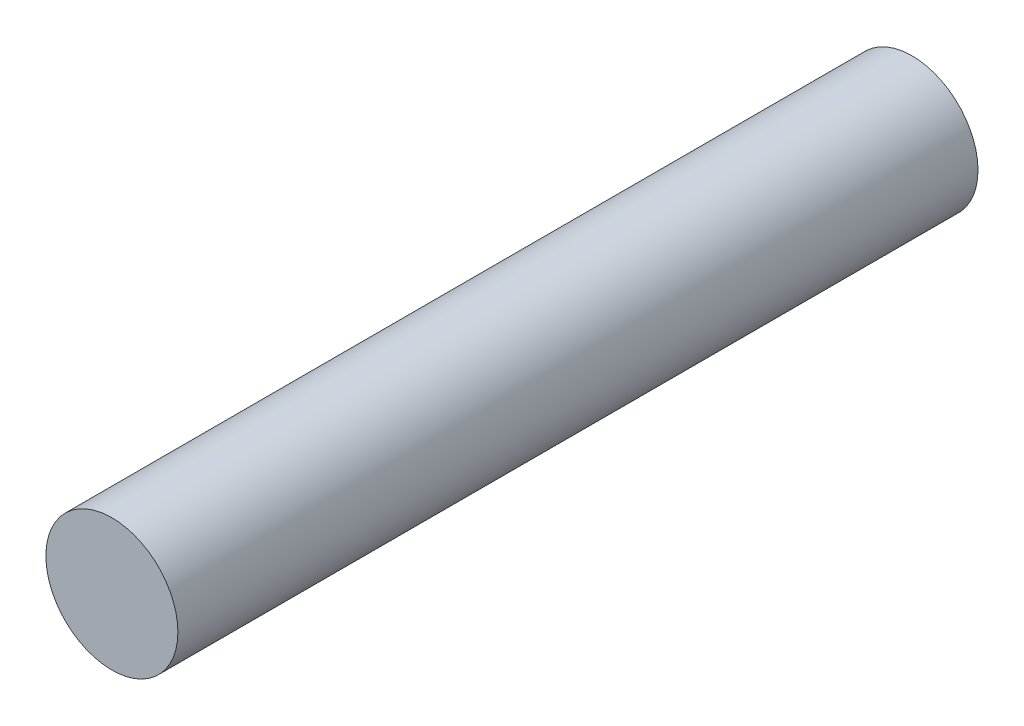
ISO-10303-21;
HEADER;
FILE_DESCRIPTION(('STEP AP214'),'2;1');
FILE_NAME('part.step','',(''),(''),'','','');
FILE_SCHEMA(('AUTOMOTIVE_DESIGN { 1 0 10303 214 1 1 1 1 }'));
ENDSEC;
DATA;
#1=APPLICATION_CONTEXT('core data for automotive mechanical design processes');
#2=APPLICATION_PROTOCOL_DEFINITION('international standard','automotive_design',2000,#1);
#3=PRODUCT_CONTEXT('',#1,'mechanical');
#4=PRODUCT('Part','Part','',(#3));
#5=PRODUCT_RELATED_PRODUCT_CATEGORY('part','',(#4));
#6=PRODUCT_DEFINITION_FORMATION('','',#4);
#7=PRODUCT_DEFINITION_CONTEXT('part definition',#1,'design');
#8=PRODUCT_DEFINITION('design','',#6,#7);
#9=PRODUCT_DEFINITION_SHAPE('','',#8);
#10=(LENGTH_UNIT() NAMED_UNIT(*) SI_UNIT(.MILLI.,.METRE.));
#11=(NAMED_UNIT(*) PLANE_ANGLE_UNIT() SI_UNIT($,.RADIAN.));
#12=(NAMED_UNIT(*) SI_UNIT($,.STERADIAN.) SOLID_ANGLE_UNIT());
#13=UNCERTAINTY_MEASURE_WITH_UNIT(LENGTH_MEASURE(1.E-05),#10,'distance_accuracy_value','');
#14=(GEOMETRIC_REPRESENTATION_CONTEXT(3) GLOBAL_UNCERTAINTY_ASSIGNED_CONTEXT((#13)) GLOBAL_UNIT_ASSIGNED_CONTEXT((#10,
#11,#12)) REPRESENTATION_CONTEXT('',''));
#15=CARTESIAN_POINT('',(0.,0.,0.));
#16=DIRECTION('',(0.,0.,1.));
#17=DIRECTION('',(1.,0.,0.));
#18=AXIS2_PLACEMENT_3D('',#15,#16,#17);
#19=CARTESIAN_POINT('',(0.,0.,200.));
#20=DIRECTION('',(0.,0.,-1.));
#21=DIRECTION('',(-1.,0.,0.));
#22=AXIS2_PLACEMENT_3D('',#19,#20,#21);
#23=CYLINDRICAL_SURFACE('',#22,16.5);
#24=CARTESIAN_POINT('',(0.,0.,200.));
#25=DIRECTION('',(0.,0.,1.));
#26=DIRECTION('',(1.,0.,0.));
#27=AXIS2_PLACEMENT_3D('',#24,#25,#26);
#28=CIRCLE('',#27,16.5);
#29=CARTESIAN_POINT('',(16.5,0.,200.));
#30=VERTEX_POINT('',#29);
#31=EDGE_CURVE('E10',#30,#30,#28,.T.);
#32=ORIENTED_EDGE('',*,*,#31,.F.);
#33=EDGE_LOOP('',(#32));
#34=FACE_BOUND('',#33,.T.);
#35=CARTESIAN_POINT('',(0.,0.,0.));
#36=DIRECTION('',(0.,0.,1.));
#37=DIRECTION('',(1.,0.,0.));
#38=AXIS2_PLACEMENT_3D('',#35,#36,#37);
#39=CIRCLE('',#38,16.5);
#40=CARTESIAN_POINT('',(16.5,0.,0.));
#41=VERTEX_POINT('',#40);
#42=EDGE_CURVE('E46',#41,#41,#39,.T.);
#43=ORIENTED_EDGE('',*,*,#42,.T.);
#44=EDGE_LOOP('',(#43));
#45=FACE_BOUND('',#44,.T.);
#46=ADVANCED_FACE('F43',(#34,#45),#23,.T.);
#47=CARTESIAN_POINT('',(0.,0.,200.));
#48=DIRECTION('',(0.,0.,1.));
#49=DIRECTION('',(1.,0.,0.));
#50=AXIS2_PLACEMENT_3D('',#47,#48,#49);
#51=PLANE('',#50);
#52=ORIENTED_EDGE('',*,*,#31,.T.);
#53=EDGE_LOOP('',(#52));
#54=FACE_BOUND('',#53,.T.);
#55=ADVANCED_FACE('F60',(#54),#51,.T.);
#56=CARTESIAN_POINT('',(0.,0.,0.));
#57=DIRECTION('',(0.,0.,1.));
#58=DIRECTION('',(1.,0.,0.));
#59=AXIS2_PLACEMENT_3D('',#56,#57,#58);
#60=PLANE('',#59);
#61=ORIENTED_EDGE('',*,*,#42,.F.);
#62=EDGE_LOOP('',(#61));
#63=FACE_BOUND('',#62,.T.);
#64=ADVANCED_FACE('F58',(#63),#60,.F.);
#65=CLOSED_SHELL('',(#46,#55,#64));
#66=MANIFOLD_SOLID_BREP('B2',#65);
#67=ADVANCED_BREP_SHAPE_REPRESENTATION('',(#18,#66),#14);
#68=SHAPE_DEFINITION_REPRESENTATION(#9,#67);
ENDSEC;
END-ISO-10303-21;
